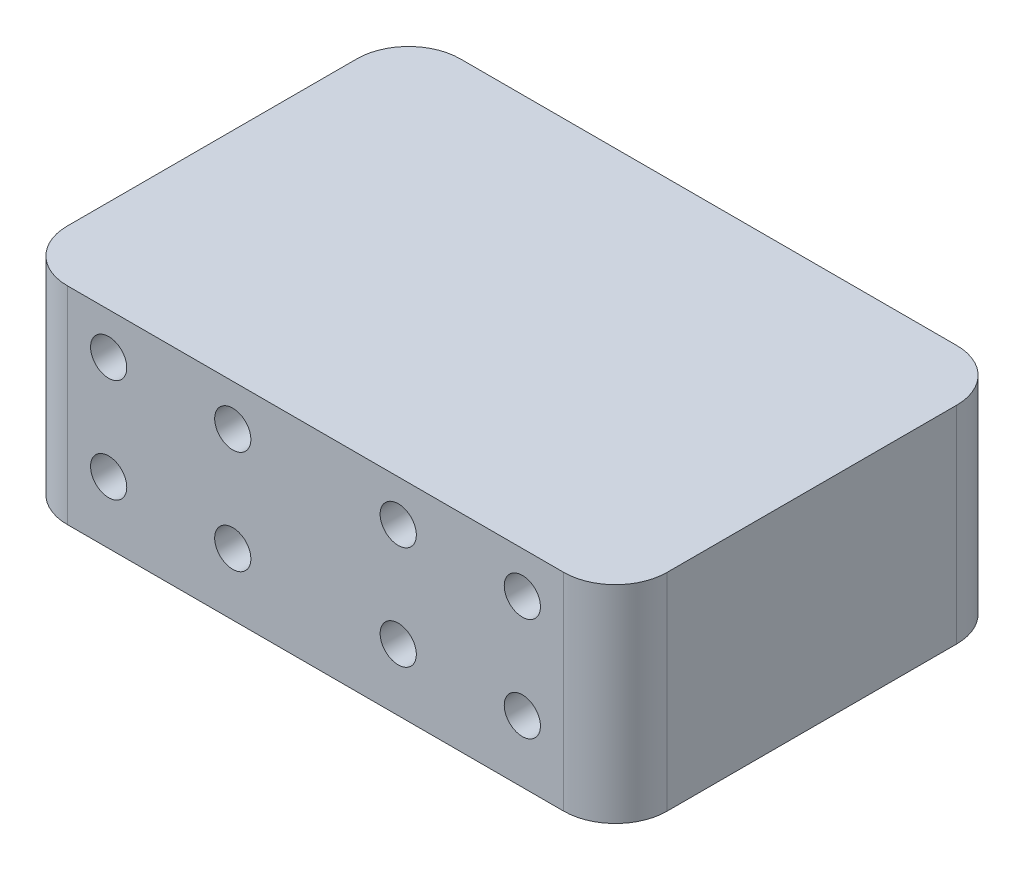
ISO-10303-21;
HEADER;
FILE_DESCRIPTION(('STEP AP214'),'2;1');
FILE_NAME('part.step','',(''),(''),'','','');
FILE_SCHEMA(('AUTOMOTIVE_DESIGN { 1 0 10303 214 1 1 1 1 }'));
ENDSEC;
DATA;
#1=APPLICATION_CONTEXT('core data for automotive mechanical design processes');
#2=APPLICATION_PROTOCOL_DEFINITION('international standard','automotive_design',2000,#1);
#3=PRODUCT_CONTEXT('',#1,'mechanical');
#4=PRODUCT('Part','Part','',(#3));
#5=PRODUCT_RELATED_PRODUCT_CATEGORY('part','',(#4));
#6=PRODUCT_DEFINITION_FORMATION('','',#4);
#7=PRODUCT_DEFINITION_CONTEXT('part definition',#1,'design');
#8=PRODUCT_DEFINITION('design','',#6,#7);
#9=PRODUCT_DEFINITION_SHAPE('','',#8);
#10=(LENGTH_UNIT() NAMED_UNIT(*) SI_UNIT(.MILLI.,.METRE.));
#11=(NAMED_UNIT(*) PLANE_ANGLE_UNIT() SI_UNIT($,.RADIAN.));
#12=(NAMED_UNIT(*) SI_UNIT($,.STERADIAN.) SOLID_ANGLE_UNIT());
#13=UNCERTAINTY_MEASURE_WITH_UNIT(LENGTH_MEASURE(1.E-05),#10,'distance_accuracy_value','');
#14=(GEOMETRIC_REPRESENTATION_CONTEXT(3) GLOBAL_UNCERTAINTY_ASSIGNED_CONTEXT((#13)) GLOBAL_UNIT_ASSIGNED_CONTEXT((#10,
#11,#12)) REPRESENTATION_CONTEXT('',''));
#15=CARTESIAN_POINT('',(0.,0.,0.));
#16=DIRECTION('',(0.,0.,1.));
#17=DIRECTION('',(1.,0.,0.));
#18=AXIS2_PLACEMENT_3D('',#15,#16,#17);
#19=CARTESIAN_POINT('',(0.,0.,38.));
#20=DIRECTION('',(0.,0.,-1.));
#21=DIRECTION('',(-1.,0.,0.));
#22=AXIS2_PLACEMENT_3D('',#19,#20,#21);
#23=PLANE('',#22);
#24=DIRECTION('',(-1.,0.,0.));
#25=VECTOR('',#24,1.);
#26=CARTESIAN_POINT('',(-29.,10.,38.));
#27=LINE('',#26,#25);
#28=CARTESIAN_POINT('',(24.,10.,38.));
#29=VERTEX_POINT('',#28);
#30=CARTESIAN_POINT('',(-24.,10.,38.));
#31=VERTEX_POINT('',#30);
#32=EDGE_CURVE('E193',#29,#31,#27,.T.);
#33=ORIENTED_EDGE('',*,*,#32,.T.);
#34=DIRECTION('',(0.,-1.,0.));
#35=VECTOR('',#34,1.);
#36=CARTESIAN_POINT('',(-24.,0.,38.));
#37=LINE('',#36,#35);
#38=CARTESIAN_POINT('',(-24.,-10.,38.));
#39=VERTEX_POINT('',#38);
#40=EDGE_CURVE('E175',#31,#39,#37,.T.);
#41=ORIENTED_EDGE('',*,*,#40,.T.);
#42=DIRECTION('',(1.,0.,0.));
#43=VECTOR('',#42,1.);
#44=CARTESIAN_POINT('',(-29.,-10.,38.));
#45=LINE('',#44,#43);
#46=CARTESIAN_POINT('',(24.,-10.,38.));
#47=VERTEX_POINT('',#46);
#48=EDGE_CURVE('E116',#39,#47,#45,.T.);
#49=ORIENTED_EDGE('',*,*,#48,.T.);
#50=DIRECTION('',(0.,1.,0.));
#51=VECTOR('',#50,1.);
#52=CARTESIAN_POINT('',(24.,0.,38.));
#53=LINE('',#52,#51);
#54=EDGE_CURVE('E171',#47,#29,#53,.T.);
#55=ORIENTED_EDGE('',*,*,#54,.T.);
#56=EDGE_LOOP('',(#33,#41,#49,#55));
#57=FACE_BOUND('',#56,.T.);
#58=CARTESIAN_POINT('',(-20.,5.99999999999999,38.));
#59=DIRECTION('',(0.,0.,1.));
#60=DIRECTION('',(1.,0.,0.));
#61=AXIS2_PLACEMENT_3D('',#58,#59,#60);
#62=CIRCLE('',#61,1.75);
#63=CARTESIAN_POINT('',(-18.25,5.99999999999999,38.));
#64=VERTEX_POINT('',#63);
#65=EDGE_CURVE('E209',#64,#64,#62,.T.);
#66=ORIENTED_EDGE('',*,*,#65,.F.);
#67=EDGE_LOOP('',(#66));
#68=FACE_BOUND('',#67,.T.);
#69=CARTESIAN_POINT('',(-8.,5.99999999999999,38.));
#70=DIRECTION('',(0.,0.,1.));
#71=DIRECTION('',(1.,0.,0.));
#72=AXIS2_PLACEMENT_3D('',#69,#70,#71);
#73=CIRCLE('',#72,1.75);
#74=CARTESIAN_POINT('',(-6.25,5.99999999999999,38.));
#75=VERTEX_POINT('',#74);
#76=EDGE_CURVE('E287',#75,#75,#73,.T.);
#77=ORIENTED_EDGE('',*,*,#76,.F.);
#78=EDGE_LOOP('',(#77));
#79=FACE_BOUND('',#78,.T.);
#80=CARTESIAN_POINT('',(8.,5.99999999999999,38.));
#81=DIRECTION('',(0.,0.,1.));
#82=DIRECTION('',(-1.,0.,0.));
#83=AXIS2_PLACEMENT_3D('',#80,#81,#82);
#84=CIRCLE('',#83,1.75);
#85=CARTESIAN_POINT('',(6.25000000000001,5.99999999999999,38.));
#86=VERTEX_POINT('',#85);
#87=EDGE_CURVE('E292',#86,#86,#84,.T.);
#88=ORIENTED_EDGE('',*,*,#87,.F.);
#89=EDGE_LOOP('',(#88));
#90=FACE_BOUND('',#89,.T.);
#91=CARTESIAN_POINT('',(20.,5.99999999999999,38.));
#92=DIRECTION('',(0.,0.,1.));
#93=DIRECTION('',(-1.,0.,0.));
#94=AXIS2_PLACEMENT_3D('',#91,#92,#93);
#95=CIRCLE('',#94,1.75);
#96=CARTESIAN_POINT('',(18.25,5.99999999999999,38.));
#97=VERTEX_POINT('',#96);
#98=EDGE_CURVE('E316',#97,#97,#95,.T.);
#99=ORIENTED_EDGE('',*,*,#98,.F.);
#100=EDGE_LOOP('',(#99));
#101=FACE_BOUND('',#100,.T.);
#102=CARTESIAN_POINT('',(-20.,-4.00000000000001,38.));
#103=DIRECTION('',(0.,0.,1.));
#104=DIRECTION('',(1.,0.,0.));
#105=AXIS2_PLACEMENT_3D('',#102,#103,#104);
#106=CIRCLE('',#105,1.75);
#107=CARTESIAN_POINT('',(-18.25,-4.00000000000001,38.));
#108=VERTEX_POINT('',#107);
#109=EDGE_CURVE('E320',#108,#108,#106,.T.);
#110=ORIENTED_EDGE('',*,*,#109,.F.);
#111=EDGE_LOOP('',(#110));
#112=FACE_BOUND('',#111,.T.);
#113=CARTESIAN_POINT('',(-8.,-4.00000000000001,38.));
#114=DIRECTION('',(0.,0.,1.));
#115=DIRECTION('',(1.,0.,0.));
#116=AXIS2_PLACEMENT_3D('',#113,#114,#115);
#117=CIRCLE('',#116,1.75);
#118=CARTESIAN_POINT('',(-6.25,-4.00000000000001,38.));
#119=VERTEX_POINT('',#118);
#120=EDGE_CURVE('E324',#119,#119,#117,.T.);
#121=ORIENTED_EDGE('',*,*,#120,.F.);
#122=EDGE_LOOP('',(#121));
#123=FACE_BOUND('',#122,.T.);
#124=CARTESIAN_POINT('',(8.,-4.00000000000001,38.));
#125=DIRECTION('',(0.,0.,1.));
#126=DIRECTION('',(-1.,0.,0.));
#127=AXIS2_PLACEMENT_3D('',#124,#125,#126);
#128=CIRCLE('',#127,1.75);
#129=CARTESIAN_POINT('',(6.25000000000001,-4.00000000000001,38.));
#130=VERTEX_POINT('',#129);
#131=EDGE_CURVE('E328',#130,#130,#128,.T.);
#132=ORIENTED_EDGE('',*,*,#131,.F.);
#133=EDGE_LOOP('',(#132));
#134=FACE_BOUND('',#133,.T.);
#135=CARTESIAN_POINT('',(20.,-4.00000000000001,38.));
#136=DIRECTION('',(0.,0.,1.));
#137=DIRECTION('',(-1.,0.,0.));
#138=AXIS2_PLACEMENT_3D('',#135,#136,#137);
#139=CIRCLE('',#138,1.75);
#140=CARTESIAN_POINT('',(18.25,-4.00000000000001,38.));
#141=VERTEX_POINT('',#140);
#142=EDGE_CURVE('E330',#141,#141,#139,.T.);
#143=ORIENTED_EDGE('',*,*,#142,.F.);
#144=EDGE_LOOP('',(#143));
#145=FACE_BOUND('',#144,.T.);
#146=ADVANCED_FACE('F44',(#57,#68,#79,#90,#101,#112,#123,#134,#145),#23,.F.);
#147=CARTESIAN_POINT('',(0.,0.,0.));
#148=DIRECTION('',(0.,0.,-1.));
#149=DIRECTION('',(-1.,0.,0.));
#150=AXIS2_PLACEMENT_3D('',#147,#148,#149);
#151=PLANE('',#150);
#152=CARTESIAN_POINT('',(8.,-4.00000000000001,0.));
#153=DIRECTION('',(0.,0.,1.));
#154=DIRECTION('',(-1.,0.,0.));
#155=AXIS2_PLACEMENT_3D('',#152,#153,#154);
#156=CIRCLE('',#155,1.75);
#157=CARTESIAN_POINT('',(6.25000000000001,-4.00000000000001,0.));
#158=VERTEX_POINT('',#157);
#159=EDGE_CURVE('E332',#158,#158,#156,.T.);
#160=ORIENTED_EDGE('',*,*,#159,.T.);
#161=EDGE_LOOP('',(#160));
#162=FACE_BOUND('',#161,.T.);
#163=CARTESIAN_POINT('',(-20.,-4.00000000000001,0.));
#164=DIRECTION('',(0.,0.,1.));
#165=DIRECTION('',(1.,0.,0.));
#166=AXIS2_PLACEMENT_3D('',#163,#164,#165);
#167=CIRCLE('',#166,1.75);
#168=CARTESIAN_POINT('',(-18.25,-4.00000000000001,0.));
#169=VERTEX_POINT('',#168);
#170=EDGE_CURVE('E347',#169,#169,#167,.T.);
#171=ORIENTED_EDGE('',*,*,#170,.T.);
#172=EDGE_LOOP('',(#171));
#173=FACE_BOUND('',#172,.T.);
#174=CARTESIAN_POINT('',(8.,5.99999999999999,0.));
#175=DIRECTION('',(0.,0.,1.));
#176=DIRECTION('',(-1.,0.,0.));
#177=AXIS2_PLACEMENT_3D('',#174,#175,#176);
#178=CIRCLE('',#177,1.75);
#179=CARTESIAN_POINT('',(6.25000000000001,5.99999999999999,0.));
#180=VERTEX_POINT('',#179);
#181=EDGE_CURVE('E298',#180,#180,#178,.T.);
#182=ORIENTED_EDGE('',*,*,#181,.T.);
#183=EDGE_LOOP('',(#182));
#184=FACE_BOUND('',#183,.T.);
#185=CARTESIAN_POINT('',(-20.,5.99999999999999,0.));
#186=DIRECTION('',(0.,0.,1.));
#187=DIRECTION('',(1.,0.,0.));
#188=AXIS2_PLACEMENT_3D('',#185,#186,#187);
#189=CIRCLE('',#188,1.75);
#190=CARTESIAN_POINT('',(-18.25,5.99999999999999,0.));
#191=VERTEX_POINT('',#190);
#192=EDGE_CURVE('E205',#191,#191,#189,.T.);
#193=ORIENTED_EDGE('',*,*,#192,.T.);
#194=EDGE_LOOP('',(#193));
#195=FACE_BOUND('',#194,.T.);
#196=DIRECTION('',(1.,0.,0.));
#197=VECTOR('',#196,1.);
#198=CARTESIAN_POINT('',(-29.,-10.,0.));
#199=LINE('',#198,#197);
#200=CARTESIAN_POINT('',(-24.,-10.,0.));
#201=VERTEX_POINT('',#200);
#202=CARTESIAN_POINT('',(24.,-10.,0.));
#203=VERTEX_POINT('',#202);
#204=EDGE_CURVE('E197',#201,#203,#199,.T.);
#205=ORIENTED_EDGE('',*,*,#204,.F.);
#206=DIRECTION('',(0.,-1.,0.));
#207=VECTOR('',#206,1.);
#208=CARTESIAN_POINT('',(-24.,10.,0.));
#209=LINE('',#208,#207);
#210=CARTESIAN_POINT('',(-24.,10.,0.));
#211=VERTEX_POINT('',#210);
#212=EDGE_CURVE('E159',#201,#211,#209,.F.);
#213=ORIENTED_EDGE('',*,*,#212,.T.);
#214=DIRECTION('',(-1.,0.,0.));
#215=VECTOR('',#214,1.);
#216=CARTESIAN_POINT('',(-29.,10.,0.));
#217=LINE('',#216,#215);
#218=CARTESIAN_POINT('',(24.,10.,0.));
#219=VERTEX_POINT('',#218);
#220=EDGE_CURVE('E202',#219,#211,#217,.T.);
#221=ORIENTED_EDGE('',*,*,#220,.F.);
#222=DIRECTION('',(0.,1.,0.));
#223=VECTOR('',#222,1.);
#224=CARTESIAN_POINT('',(24.,-10.,0.));
#225=LINE('',#224,#223);
#226=EDGE_CURVE('E156',#219,#203,#225,.F.);
#227=ORIENTED_EDGE('',*,*,#226,.T.);
#228=EDGE_LOOP('',(#205,#213,#221,#227));
#229=FACE_BOUND('',#228,.T.);
#230=CARTESIAN_POINT('',(-8.,5.99999999999999,0.));
#231=DIRECTION('',(0.,0.,1.));
#232=DIRECTION('',(1.,0.,0.));
#233=AXIS2_PLACEMENT_3D('',#230,#231,#232);
#234=CIRCLE('',#233,1.75);
#235=CARTESIAN_POINT('',(-6.25,5.99999999999999,0.));
#236=VERTEX_POINT('',#235);
#237=EDGE_CURVE('E290',#236,#236,#234,.T.);
#238=ORIENTED_EDGE('',*,*,#237,.T.);
#239=EDGE_LOOP('',(#238));
#240=FACE_BOUND('',#239,.T.);
#241=CARTESIAN_POINT('',(20.,5.99999999999999,0.));
#242=DIRECTION('',(0.,0.,1.));
#243=DIRECTION('',(-1.,0.,0.));
#244=AXIS2_PLACEMENT_3D('',#241,#242,#243);
#245=CIRCLE('',#244,1.75);
#246=CARTESIAN_POINT('',(18.25,5.99999999999999,0.));
#247=VERTEX_POINT('',#246);
#248=EDGE_CURVE('E353',#247,#247,#245,.T.);
#249=ORIENTED_EDGE('',*,*,#248,.T.);
#250=EDGE_LOOP('',(#249));
#251=FACE_BOUND('',#250,.T.);
#252=CARTESIAN_POINT('',(-8.,-4.00000000000001,0.));
#253=DIRECTION('',(0.,0.,1.));
#254=DIRECTION('',(1.,0.,0.));
#255=AXIS2_PLACEMENT_3D('',#252,#253,#254);
#256=CIRCLE('',#255,1.75);
#257=CARTESIAN_POINT('',(-6.25,-4.00000000000001,0.));
#258=VERTEX_POINT('',#257);
#259=EDGE_CURVE('E343',#258,#258,#256,.T.);
#260=ORIENTED_EDGE('',*,*,#259,.T.);
#261=EDGE_LOOP('',(#260));
#262=FACE_BOUND('',#261,.T.);
#263=CARTESIAN_POINT('',(20.,-4.00000000000001,0.));
#264=DIRECTION('',(0.,0.,1.));
#265=DIRECTION('',(-1.,0.,0.));
#266=AXIS2_PLACEMENT_3D('',#263,#264,#265);
#267=CIRCLE('',#266,1.75);
#268=CARTESIAN_POINT('',(18.25,-4.00000000000001,0.));
#269=VERTEX_POINT('',#268);
#270=EDGE_CURVE('E333',#269,#269,#267,.T.);
#271=ORIENTED_EDGE('',*,*,#270,.T.);
#272=EDGE_LOOP('',(#271));
#273=FACE_BOUND('',#272,.T.);
#274=ADVANCED_FACE('F217',(#162,#173,#184,#195,#229,#240,#251,#262,#273),#151,.T.);
#275=CARTESIAN_POINT('',(29.,-10.,38.));
#276=DIRECTION('',(-1.,0.,0.));
#277=DIRECTION('',(0.,0.,1.));
#278=AXIS2_PLACEMENT_3D('',#275,#276,#277);
#279=PLANE('',#278);
#280=DIRECTION('',(0.,0.,-1.));
#281=VECTOR('',#280,1.);
#282=CARTESIAN_POINT('',(29.,-10.,38.));
#283=LINE('',#282,#281);
#284=CARTESIAN_POINT('',(29.,-10.,33.));
#285=VERTEX_POINT('',#284);
#286=CARTESIAN_POINT('',(29.,-10.,5.));
#287=VERTEX_POINT('',#286);
#288=EDGE_CURVE('E135',#285,#287,#283,.T.);
#289=ORIENTED_EDGE('',*,*,#288,.T.);
#290=DIRECTION('',(0.,1.,0.));
#291=VECTOR('',#290,1.);
#292=CARTESIAN_POINT('',(29.,10.,5.));
#293=LINE('',#292,#291);
#294=CARTESIAN_POINT('',(29.,10.,5.));
#295=VERTEX_POINT('',#294);
#296=EDGE_CURVE('E11',#287,#295,#293,.T.);
#297=ORIENTED_EDGE('',*,*,#296,.T.);
#298=DIRECTION('',(0.,0.,-1.));
#299=VECTOR('',#298,1.);
#300=CARTESIAN_POINT('',(29.,10.,38.));
#301=LINE('',#300,#299);
#302=CARTESIAN_POINT('',(29.,10.,33.));
#303=VERTEX_POINT('',#302);
#304=EDGE_CURVE('E141',#303,#295,#301,.T.);
#305=ORIENTED_EDGE('',*,*,#304,.F.);
#306=DIRECTION('',(0.,1.,0.));
#307=VECTOR('',#306,1.);
#308=CARTESIAN_POINT('',(29.,-10.,33.));
#309=LINE('',#308,#307);
#310=EDGE_CURVE('E53',#303,#285,#309,.F.);
#311=ORIENTED_EDGE('',*,*,#310,.T.);
#312=EDGE_LOOP('',(#289,#297,#305,#311));
#313=FACE_BOUND('',#312,.T.);
#314=ADVANCED_FACE('F182',(#313),#279,.F.);
#315=CARTESIAN_POINT('',(-29.,10.,38.));
#316=DIRECTION('',(0.,-1.,0.));
#317=DIRECTION('',(0.,0.,-1.));
#318=AXIS2_PLACEMENT_3D('',#315,#316,#317);
#319=PLANE('',#318);
#320=ORIENTED_EDGE('',*,*,#220,.T.);
#321=CARTESIAN_POINT('',(-24.,10.,5.));
#322=DIRECTION('',(0.,-1.,0.));
#323=DIRECTION('',(0.,0.,-1.));
#324=AXIS2_PLACEMENT_3D('',#321,#322,#323);
#325=CIRCLE('',#324,5.);
#326=CARTESIAN_POINT('',(-29.,10.,5.));
#327=VERTEX_POINT('',#326);
#328=EDGE_CURVE('E168',#211,#327,#325,.F.);
#329=ORIENTED_EDGE('',*,*,#328,.T.);
#330=DIRECTION('',(0.,0.,-1.));
#331=VECTOR('',#330,1.);
#332=CARTESIAN_POINT('',(-29.,10.,38.));
#333=LINE('',#332,#331);
#334=CARTESIAN_POINT('',(-29.,10.,33.));
#335=VERTEX_POINT('',#334);
#336=EDGE_CURVE('E134',#335,#327,#333,.T.);
#337=ORIENTED_EDGE('',*,*,#336,.F.);
#338=CARTESIAN_POINT('',(-24.,10.,33.));
#339=DIRECTION('',(0.,-1.,0.));
#340=DIRECTION('',(0.,0.,-1.));
#341=AXIS2_PLACEMENT_3D('',#338,#339,#340);
#342=CIRCLE('',#341,5.);
#343=EDGE_CURVE('E139',#335,#31,#342,.F.);
#344=ORIENTED_EDGE('',*,*,#343,.T.);
#345=ORIENTED_EDGE('',*,*,#32,.F.);
#346=CARTESIAN_POINT('',(24.,10.,33.));
#347=DIRECTION('',(0.,-1.,0.));
#348=DIRECTION('',(0.,0.,-1.));
#349=AXIS2_PLACEMENT_3D('',#346,#347,#348);
#350=CIRCLE('',#349,5.);
#351=EDGE_CURVE('E67',#29,#303,#350,.F.);
#352=ORIENTED_EDGE('',*,*,#351,.T.);
#353=ORIENTED_EDGE('',*,*,#304,.T.);
#354=CARTESIAN_POINT('',(24.,10.,5.));
#355=DIRECTION('',(0.,-1.,0.));
#356=DIRECTION('',(0.,0.,-1.));
#357=AXIS2_PLACEMENT_3D('',#354,#355,#356);
#358=CIRCLE('',#357,5.);
#359=EDGE_CURVE('E60',#295,#219,#358,.F.);
#360=ORIENTED_EDGE('',*,*,#359,.T.);
#361=EDGE_LOOP('',(#320,#329,#337,#344,#345,#352,#353,#360));
#362=FACE_BOUND('',#361,.T.);
#363=ADVANCED_FACE('F195',(#362),#319,.F.);
#364=CARTESIAN_POINT('',(-29.,-10.,38.));
#365=DIRECTION('',(1.,0.,0.));
#366=DIRECTION('',(0.,0.,-1.));
#367=AXIS2_PLACEMENT_3D('',#364,#365,#366);
#368=PLANE('',#367);
#369=ORIENTED_EDGE('',*,*,#336,.T.);
#370=DIRECTION('',(0.,-1.,0.));
#371=VECTOR('',#370,1.);
#372=CARTESIAN_POINT('',(-29.,-10.,5.));
#373=LINE('',#372,#371);
#374=CARTESIAN_POINT('',(-29.,-10.,5.));
#375=VERTEX_POINT('',#374);
#376=EDGE_CURVE('E132',#327,#375,#373,.T.);
#377=ORIENTED_EDGE('',*,*,#376,.T.);
#378=DIRECTION('',(0.,0.,-1.));
#379=VECTOR('',#378,1.);
#380=CARTESIAN_POINT('',(-29.,-10.,38.));
#381=LINE('',#380,#379);
#382=CARTESIAN_POINT('',(-29.,-10.,33.));
#383=VERTEX_POINT('',#382);
#384=EDGE_CURVE('E114',#383,#375,#381,.T.);
#385=ORIENTED_EDGE('',*,*,#384,.F.);
#386=DIRECTION('',(0.,-1.,0.));
#387=VECTOR('',#386,1.);
#388=CARTESIAN_POINT('',(-29.,-10.,33.));
#389=LINE('',#388,#387);
#390=EDGE_CURVE('E129',#383,#335,#389,.F.);
#391=ORIENTED_EDGE('',*,*,#390,.T.);
#392=EDGE_LOOP('',(#369,#377,#385,#391));
#393=FACE_BOUND('',#392,.T.);
#394=ADVANCED_FACE('F128',(#393),#368,.F.);
#395=CARTESIAN_POINT('',(-29.,-10.,38.));
#396=DIRECTION('',(0.,1.,0.));
#397=DIRECTION('',(0.,0.,1.));
#398=AXIS2_PLACEMENT_3D('',#395,#396,#397);
#399=PLANE('',#398);
#400=ORIENTED_EDGE('',*,*,#384,.T.);
#401=CARTESIAN_POINT('',(-24.,-10.,5.));
#402=DIRECTION('',(0.,1.,0.));
#403=DIRECTION('',(0.,0.,1.));
#404=AXIS2_PLACEMENT_3D('',#401,#402,#403);
#405=CIRCLE('',#404,5.);
#406=EDGE_CURVE('E122',#375,#201,#405,.F.);
#407=ORIENTED_EDGE('',*,*,#406,.T.);
#408=ORIENTED_EDGE('',*,*,#204,.T.);
#409=CARTESIAN_POINT('',(24.,-10.,5.));
#410=DIRECTION('',(0.,1.,0.));
#411=DIRECTION('',(0.,0.,1.));
#412=AXIS2_PLACEMENT_3D('',#409,#410,#411);
#413=CIRCLE('',#412,5.);
#414=EDGE_CURVE('E123',#203,#287,#413,.F.);
#415=ORIENTED_EDGE('',*,*,#414,.T.);
#416=ORIENTED_EDGE('',*,*,#288,.F.);
#417=CARTESIAN_POINT('',(24.,-10.,33.));
#418=DIRECTION('',(0.,1.,0.));
#419=DIRECTION('',(0.,0.,1.));
#420=AXIS2_PLACEMENT_3D('',#417,#418,#419);
#421=CIRCLE('',#420,5.);
#422=EDGE_CURVE('E145',#285,#47,#421,.F.);
#423=ORIENTED_EDGE('',*,*,#422,.T.);
#424=ORIENTED_EDGE('',*,*,#48,.F.);
#425=CARTESIAN_POINT('',(-24.,-10.,33.));
#426=DIRECTION('',(0.,1.,0.));
#427=DIRECTION('',(0.,0.,1.));
#428=AXIS2_PLACEMENT_3D('',#425,#426,#427);
#429=CIRCLE('',#428,5.);
#430=EDGE_CURVE('E111',#39,#383,#429,.F.);
#431=ORIENTED_EDGE('',*,*,#430,.T.);
#432=EDGE_LOOP('',(#400,#407,#408,#415,#416,#423,#424,#431));
#433=FACE_BOUND('',#432,.T.);
#434=ADVANCED_FACE('F113',(#433),#399,.F.);
#435=CARTESIAN_POINT('',(-20.,5.99999999999999,38.));
#436=DIRECTION('',(0.,0.,-1.));
#437=DIRECTION('',(-1.,0.,0.));
#438=AXIS2_PLACEMENT_3D('',#435,#436,#437);
#439=CYLINDRICAL_SURFACE('',#438,1.75);
#440=ORIENTED_EDGE('',*,*,#65,.T.);
#441=EDGE_LOOP('',(#440));
#442=FACE_BOUND('',#441,.T.);
#443=ORIENTED_EDGE('',*,*,#192,.F.);
#444=EDGE_LOOP('',(#443));
#445=FACE_BOUND('',#444,.T.);
#446=ADVANCED_FACE('F236',(#442,#445),#439,.F.);
#447=CARTESIAN_POINT('',(-8.,5.99999999999999,38.));
#448=DIRECTION('',(0.,0.,-1.));
#449=DIRECTION('',(-1.,0.,0.));
#450=AXIS2_PLACEMENT_3D('',#447,#448,#449);
#451=CYLINDRICAL_SURFACE('',#450,1.75);
#452=ORIENTED_EDGE('',*,*,#76,.T.);
#453=EDGE_LOOP('',(#452));
#454=FACE_BOUND('',#453,.T.);
#455=ORIENTED_EDGE('',*,*,#237,.F.);
#456=EDGE_LOOP('',(#455));
#457=FACE_BOUND('',#456,.T.);
#458=ADVANCED_FACE('F276',(#454,#457),#451,.F.);
#459=CARTESIAN_POINT('',(8.,5.99999999999999,38.));
#460=DIRECTION('',(0.,0.,-1.));
#461=DIRECTION('',(-1.,0.,0.));
#462=AXIS2_PLACEMENT_3D('',#459,#460,#461);
#463=CYLINDRICAL_SURFACE('',#462,1.75);
#464=ORIENTED_EDGE('',*,*,#87,.T.);
#465=EDGE_LOOP('',(#464));
#466=FACE_BOUND('',#465,.T.);
#467=ORIENTED_EDGE('',*,*,#181,.F.);
#468=EDGE_LOOP('',(#467));
#469=FACE_BOUND('',#468,.T.);
#470=ADVANCED_FACE('F273',(#466,#469),#463,.F.);
#471=CARTESIAN_POINT('',(20.,5.99999999999999,38.));
#472=DIRECTION('',(0.,0.,-1.));
#473=DIRECTION('',(-1.,0.,0.));
#474=AXIS2_PLACEMENT_3D('',#471,#472,#473);
#475=CYLINDRICAL_SURFACE('',#474,1.75);
#476=ORIENTED_EDGE('',*,*,#98,.T.);
#477=EDGE_LOOP('',(#476));
#478=FACE_BOUND('',#477,.T.);
#479=ORIENTED_EDGE('',*,*,#248,.F.);
#480=EDGE_LOOP('',(#479));
#481=FACE_BOUND('',#480,.T.);
#482=ADVANCED_FACE('F269',(#478,#481),#475,.F.);
#483=CARTESIAN_POINT('',(-20.,-4.00000000000001,38.));
#484=DIRECTION('',(0.,0.,-1.));
#485=DIRECTION('',(-1.,0.,0.));
#486=AXIS2_PLACEMENT_3D('',#483,#484,#485);
#487=CYLINDRICAL_SURFACE('',#486,1.75);
#488=ORIENTED_EDGE('',*,*,#109,.T.);
#489=EDGE_LOOP('',(#488));
#490=FACE_BOUND('',#489,.T.);
#491=ORIENTED_EDGE('',*,*,#170,.F.);
#492=EDGE_LOOP('',(#491));
#493=FACE_BOUND('',#492,.T.);
#494=ADVANCED_FACE('F265',(#490,#493),#487,.F.);
#495=CARTESIAN_POINT('',(-8.,-4.00000000000001,38.));
#496=DIRECTION('',(0.,0.,-1.));
#497=DIRECTION('',(-1.,0.,0.));
#498=AXIS2_PLACEMENT_3D('',#495,#496,#497);
#499=CYLINDRICAL_SURFACE('',#498,1.75);
#500=ORIENTED_EDGE('',*,*,#120,.T.);
#501=EDGE_LOOP('',(#500));
#502=FACE_BOUND('',#501,.T.);
#503=ORIENTED_EDGE('',*,*,#259,.F.);
#504=EDGE_LOOP('',(#503));
#505=FACE_BOUND('',#504,.T.);
#506=ADVANCED_FACE('F257',(#502,#505),#499,.F.);
#507=CARTESIAN_POINT('',(8.,-4.00000000000001,38.));
#508=DIRECTION('',(0.,0.,-1.));
#509=DIRECTION('',(-1.,0.,0.));
#510=AXIS2_PLACEMENT_3D('',#507,#508,#509);
#511=CYLINDRICAL_SURFACE('',#510,1.75);
#512=ORIENTED_EDGE('',*,*,#131,.T.);
#513=EDGE_LOOP('',(#512));
#514=FACE_BOUND('',#513,.T.);
#515=ORIENTED_EDGE('',*,*,#159,.F.);
#516=EDGE_LOOP('',(#515));
#517=FACE_BOUND('',#516,.T.);
#518=ADVANCED_FACE('F251',(#514,#517),#511,.F.);
#519=CARTESIAN_POINT('',(20.,-4.00000000000001,38.));
#520=DIRECTION('',(0.,0.,-1.));
#521=DIRECTION('',(-1.,0.,0.));
#522=AXIS2_PLACEMENT_3D('',#519,#520,#521);
#523=CYLINDRICAL_SURFACE('',#522,1.75);
#524=ORIENTED_EDGE('',*,*,#142,.T.);
#525=EDGE_LOOP('',(#524));
#526=FACE_BOUND('',#525,.T.);
#527=ORIENTED_EDGE('',*,*,#270,.F.);
#528=EDGE_LOOP('',(#527));
#529=FACE_BOUND('',#528,.T.);
#530=ADVANCED_FACE('F248',(#526,#529),#523,.F.);
#531=CARTESIAN_POINT('',(-24.,-10.,5.));
#532=DIRECTION('',(0.,1.,0.));
#533=DIRECTION('',(0.,0.,1.));
#534=AXIS2_PLACEMENT_3D('',#531,#532,#533);
#535=CYLINDRICAL_SURFACE('',#534,5.);
#536=ORIENTED_EDGE('',*,*,#328,.F.);
#537=ORIENTED_EDGE('',*,*,#212,.F.);
#538=ORIENTED_EDGE('',*,*,#406,.F.);
#539=ORIENTED_EDGE('',*,*,#376,.F.);
#540=EDGE_LOOP('',(#536,#537,#538,#539));
#541=FACE_BOUND('',#540,.T.);
#542=ADVANCED_FACE('F213',(#541),#535,.T.);
#543=CARTESIAN_POINT('',(-24.,0.,33.));
#544=DIRECTION('',(0.,-1.,0.));
#545=DIRECTION('',(0.,0.,-1.));
#546=AXIS2_PLACEMENT_3D('',#543,#544,#545);
#547=CYLINDRICAL_SURFACE('',#546,5.);
#548=ORIENTED_EDGE('',*,*,#343,.F.);
#549=ORIENTED_EDGE('',*,*,#390,.F.);
#550=ORIENTED_EDGE('',*,*,#430,.F.);
#551=ORIENTED_EDGE('',*,*,#40,.F.);
#552=EDGE_LOOP('',(#548,#549,#550,#551));
#553=FACE_BOUND('',#552,.T.);
#554=ADVANCED_FACE('F138',(#553),#547,.T.);
#555=CARTESIAN_POINT('',(24.,-10.,5.));
#556=DIRECTION('',(0.,-1.,0.));
#557=DIRECTION('',(0.,0.,-1.));
#558=AXIS2_PLACEMENT_3D('',#555,#556,#557);
#559=CYLINDRICAL_SURFACE('',#558,5.);
#560=ORIENTED_EDGE('',*,*,#414,.F.);
#561=ORIENTED_EDGE('',*,*,#226,.F.);
#562=ORIENTED_EDGE('',*,*,#359,.F.);
#563=ORIENTED_EDGE('',*,*,#296,.F.);
#564=EDGE_LOOP('',(#560,#561,#562,#563));
#565=FACE_BOUND('',#564,.T.);
#566=ADVANCED_FACE('F220',(#565),#559,.T.);
#567=CARTESIAN_POINT('',(24.,0.,33.));
#568=DIRECTION('',(0.,1.,0.));
#569=DIRECTION('',(0.,0.,1.));
#570=AXIS2_PLACEMENT_3D('',#567,#568,#569);
#571=CYLINDRICAL_SURFACE('',#570,5.);
#572=ORIENTED_EDGE('',*,*,#422,.F.);
#573=ORIENTED_EDGE('',*,*,#310,.F.);
#574=ORIENTED_EDGE('',*,*,#351,.F.);
#575=ORIENTED_EDGE('',*,*,#54,.F.);
#576=EDGE_LOOP('',(#572,#573,#574,#575));
#577=FACE_BOUND('',#576,.T.);
#578=ADVANCED_FACE('F46',(#577),#571,.T.);
#579=CLOSED_SHELL('',(#146,#274,#314,#363,#394,#434,#446,#458,#470,#482,#494,#506,#518,#530,
#542,#554,#566,#578));
#580=MANIFOLD_SOLID_BREP('B2',#579);
#581=ADVANCED_BREP_SHAPE_REPRESENTATION('',(#18,#580),#14);
#582=SHAPE_DEFINITION_REPRESENTATION(#9,#581);
ENDSEC;
END-ISO-10303-21;
